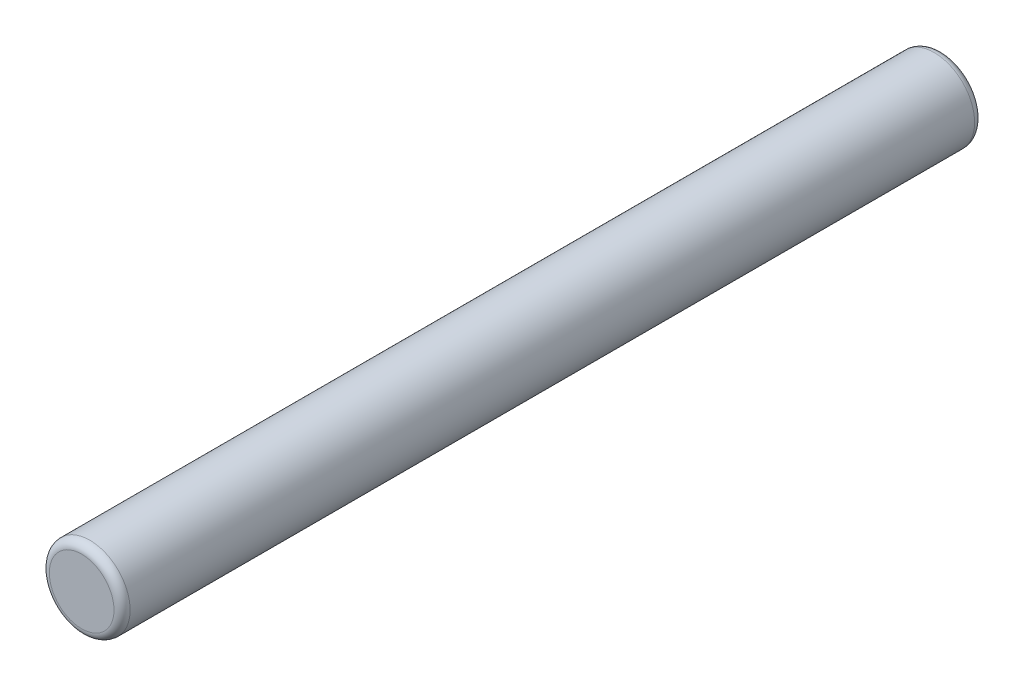
ISO-10303-21;
HEADER;
FILE_DESCRIPTION(('STEP AP214'),'2;1');
FILE_NAME('part.step','',(''),(''),'','','');
FILE_SCHEMA(('AUTOMOTIVE_DESIGN { 1 0 10303 214 1 1 1 1 }'));
ENDSEC;
DATA;
#1=APPLICATION_CONTEXT('core data for automotive mechanical design processes');
#2=APPLICATION_PROTOCOL_DEFINITION('international standard','automotive_design',2000,#1);
#3=PRODUCT_CONTEXT('',#1,'mechanical');
#4=PRODUCT('Part','Part','',(#3));
#5=PRODUCT_RELATED_PRODUCT_CATEGORY('part','',(#4));
#6=PRODUCT_DEFINITION_FORMATION('','',#4);
#7=PRODUCT_DEFINITION_CONTEXT('part definition',#1,'design');
#8=PRODUCT_DEFINITION('design','',#6,#7);
#9=PRODUCT_DEFINITION_SHAPE('','',#8);
#10=(LENGTH_UNIT() NAMED_UNIT(*) SI_UNIT(.MILLI.,.METRE.));
#11=(NAMED_UNIT(*) PLANE_ANGLE_UNIT() SI_UNIT($,.RADIAN.));
#12=(NAMED_UNIT(*) SI_UNIT($,.STERADIAN.) SOLID_ANGLE_UNIT());
#13=UNCERTAINTY_MEASURE_WITH_UNIT(LENGTH_MEASURE(1.E-05),#10,'distance_accuracy_value','');
#14=(GEOMETRIC_REPRESENTATION_CONTEXT(3) GLOBAL_UNCERTAINTY_ASSIGNED_CONTEXT((#13)) GLOBAL_UNIT_ASSIGNED_CONTEXT((#10,
#11,#12)) REPRESENTATION_CONTEXT('',''));
#15=CARTESIAN_POINT('',(0.,0.,0.));
#16=DIRECTION('',(0.,0.,1.));
#17=DIRECTION('',(1.,0.,0.));
#18=AXIS2_PLACEMENT_3D('',#15,#16,#17);
#19=CARTESIAN_POINT('',(0.,0.,15.975));
#20=DIRECTION('',(0.,0.,1.));
#21=DIRECTION('',(1.,0.,0.));
#22=AXIS2_PLACEMENT_3D('',#19,#20,#21);
#23=PLANE('',#22);
#24=CARTESIAN_POINT('',(0.,0.,15.975));
#25=DIRECTION('',(0.,0.,-1.));
#26=DIRECTION('',(-1.,0.,0.));
#27=AXIS2_PLACEMENT_3D('',#24,#25,#26);
#28=CIRCLE('',#27,1.2);
#29=CARTESIAN_POINT('',(-1.2,0.,15.975));
#30=VERTEX_POINT('',#29);
#31=CARTESIAN_POINT('',(1.2,0.,15.975));
#32=VERTEX_POINT('',#31);
#33=EDGE_CURVE('E51',#30,#32,#28,.T.);
#34=ORIENTED_EDGE('',*,*,#33,.F.);
#35=CARTESIAN_POINT('',(0.,0.,15.975));
#36=DIRECTION('',(0.,0.,-1.));
#37=DIRECTION('',(1.,0.,0.));
#38=AXIS2_PLACEMENT_3D('',#35,#36,#37);
#39=CIRCLE('',#38,1.2);
#40=EDGE_CURVE('E47',#32,#30,#39,.T.);
#41=ORIENTED_EDGE('',*,*,#40,.F.);
#42=EDGE_LOOP('',(#34,#41));
#43=FACE_BOUND('',#42,.T.);
#44=ADVANCED_FACE('F18',(#43),#23,.T.);
#45=CARTESIAN_POINT('',(0.,0.,-15.975));
#46=DIRECTION('',(0.,0.,1.));
#47=DIRECTION('',(1.,0.,0.));
#48=AXIS2_PLACEMENT_3D('',#45,#46,#47);
#49=PLANE('',#48);
#50=CARTESIAN_POINT('',(0.,0.,-15.975));
#51=DIRECTION('',(0.,0.,1.));
#52=DIRECTION('',(1.,0.,0.));
#53=AXIS2_PLACEMENT_3D('',#50,#51,#52);
#54=CIRCLE('',#53,1.2);
#55=CARTESIAN_POINT('',(1.2,0.,-15.975));
#56=VERTEX_POINT('',#55);
#57=CARTESIAN_POINT('',(-1.2,0.,-15.975));
#58=VERTEX_POINT('',#57);
#59=EDGE_CURVE('E58',#56,#58,#54,.T.);
#60=ORIENTED_EDGE('',*,*,#59,.F.);
#61=CARTESIAN_POINT('',(0.,0.,-15.975));
#62=DIRECTION('',(0.,0.,1.));
#63=DIRECTION('',(-1.,0.,0.));
#64=AXIS2_PLACEMENT_3D('',#61,#62,#63);
#65=CIRCLE('',#64,1.2);
#66=EDGE_CURVE('E38',#58,#56,#65,.T.);
#67=ORIENTED_EDGE('',*,*,#66,.F.);
#68=EDGE_LOOP('',(#60,#67));
#69=FACE_BOUND('',#68,.T.);
#70=ADVANCED_FACE('F76',(#69),#49,.F.);
#71=CARTESIAN_POINT('',(0.,0.,15.675));
#72=DIRECTION('',(0.,0.,1.));
#73=DIRECTION('',(1.,0.,0.));
#74=AXIS2_PLACEMENT_3D('',#71,#72,#73);
#75=TOROIDAL_SURFACE('',#74,1.2,0.3);
#76=ORIENTED_EDGE('',*,*,#40,.T.);
#77=ORIENTED_EDGE('',*,*,#33,.T.);
#78=EDGE_LOOP('',(#76,#77));
#79=FACE_BOUND('',#78,.T.);
#80=CARTESIAN_POINT('',(0.,0.,15.675));
#81=DIRECTION('',(0.,0.,-1.));
#82=DIRECTION('',(-1.,0.,0.));
#83=AXIS2_PLACEMENT_3D('',#80,#81,#82);
#84=CIRCLE('',#83,1.5);
#85=CARTESIAN_POINT('',(-1.5,0.,15.675));
#86=VERTEX_POINT('',#85);
#87=EDGE_CURVE('E30',#86,#86,#84,.T.);
#88=ORIENTED_EDGE('',*,*,#87,.F.);
#89=EDGE_LOOP('',(#88));
#90=FACE_BOUND('',#89,.T.);
#91=ADVANCED_FACE('F56',(#79,#90),#75,.T.);
#92=CARTESIAN_POINT('',(0.,0.,-15.675));
#93=DIRECTION('',(0.,0.,1.));
#94=DIRECTION('',(1.,0.,0.));
#95=AXIS2_PLACEMENT_3D('',#92,#93,#94);
#96=TOROIDAL_SURFACE('',#95,1.2,0.3);
#97=CARTESIAN_POINT('',(0.,0.,-15.675));
#98=DIRECTION('',(0.,0.,-1.));
#99=DIRECTION('',(-1.,0.,0.));
#100=AXIS2_PLACEMENT_3D('',#97,#98,#99);
#101=CIRCLE('',#100,1.5);
#102=CARTESIAN_POINT('',(-1.5,0.,-15.675));
#103=VERTEX_POINT('',#102);
#104=EDGE_CURVE('E11',#103,#103,#101,.F.);
#105=ORIENTED_EDGE('',*,*,#104,.F.);
#106=EDGE_LOOP('',(#105));
#107=FACE_BOUND('',#106,.T.);
#108=ORIENTED_EDGE('',*,*,#59,.T.);
#109=ORIENTED_EDGE('',*,*,#66,.T.);
#110=EDGE_LOOP('',(#108,#109));
#111=FACE_BOUND('',#110,.T.);
#112=ADVANCED_FACE('F75',(#107,#111),#96,.T.);
#113=CARTESIAN_POINT('',(0.,0.,15.975));
#114=DIRECTION('',(0.,0.,-1.));
#115=DIRECTION('',(-1.,0.,0.));
#116=AXIS2_PLACEMENT_3D('',#113,#114,#115);
#117=CYLINDRICAL_SURFACE('',#116,1.5);
#118=ORIENTED_EDGE('',*,*,#104,.T.);
#119=EDGE_LOOP('',(#118));
#120=FACE_BOUND('',#119,.T.);
#121=ORIENTED_EDGE('',*,*,#87,.T.);
#122=EDGE_LOOP('',(#121));
#123=FACE_BOUND('',#122,.T.);
#124=ADVANCED_FACE('F121',(#120,#123),#117,.T.);
#125=CLOSED_SHELL('',(#44,#70,#91,#112,#124));
#126=MANIFOLD_SOLID_BREP('B1',#125);
#127=ADVANCED_BREP_SHAPE_REPRESENTATION('',(#18,#126),#14);
#128=SHAPE_DEFINITION_REPRESENTATION(#9,#127);
ENDSEC;
END-ISO-10303-21;
